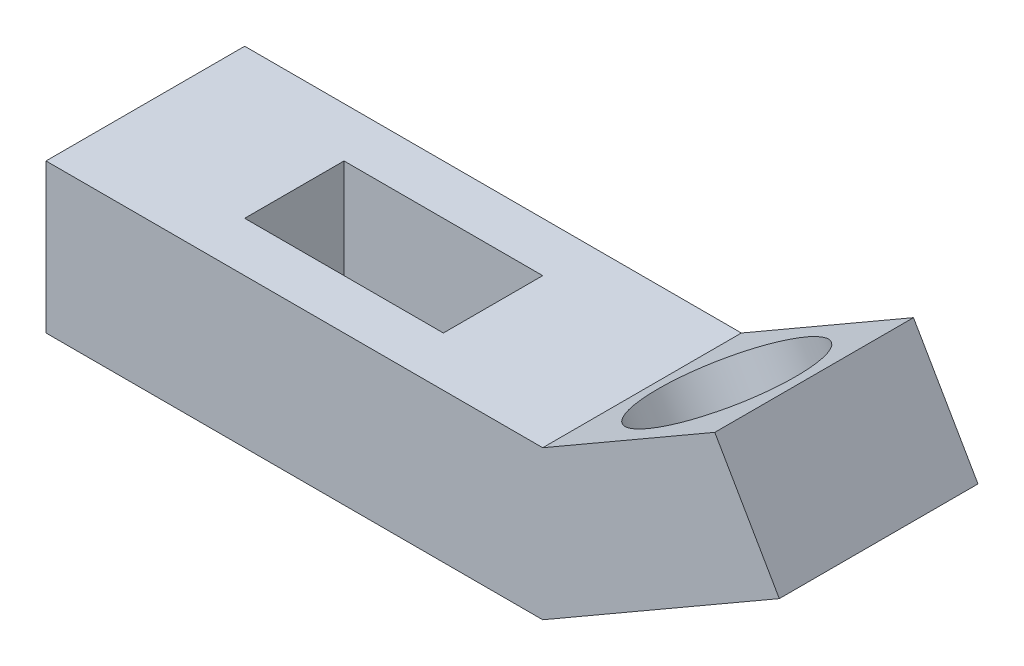
ISO-10303-21;
HEADER;
FILE_DESCRIPTION(('STEP AP214'),'2;1');
FILE_NAME('part.step','',(''),(''),'','','');
FILE_SCHEMA(('AUTOMOTIVE_DESIGN { 1 0 10303 214 1 1 1 1 }'));
ENDSEC;
DATA;
#1=APPLICATION_CONTEXT('core data for automotive mechanical design processes');
#2=APPLICATION_PROTOCOL_DEFINITION('international standard','automotive_design',2000,#1);
#3=PRODUCT_CONTEXT('',#1,'mechanical');
#4=PRODUCT('Part','Part','',(#3));
#5=PRODUCT_RELATED_PRODUCT_CATEGORY('part','',(#4));
#6=PRODUCT_DEFINITION_FORMATION('','',#4);
#7=PRODUCT_DEFINITION_CONTEXT('part definition',#1,'design');
#8=PRODUCT_DEFINITION('design','',#6,#7);
#9=PRODUCT_DEFINITION_SHAPE('','',#8);
#10=(LENGTH_UNIT() NAMED_UNIT(*) SI_UNIT(.MILLI.,.METRE.));
#11=(NAMED_UNIT(*) PLANE_ANGLE_UNIT() SI_UNIT($,.RADIAN.));
#12=(NAMED_UNIT(*) SI_UNIT($,.STERADIAN.) SOLID_ANGLE_UNIT());
#13=UNCERTAINTY_MEASURE_WITH_UNIT(LENGTH_MEASURE(1.E-05),#10,'distance_accuracy_value','');
#14=(GEOMETRIC_REPRESENTATION_CONTEXT(3) GLOBAL_UNCERTAINTY_ASSIGNED_CONTEXT((#13)) GLOBAL_UNIT_ASSIGNED_CONTEXT((#10,
#11,#12)) REPRESENTATION_CONTEXT('',''));
#15=CARTESIAN_POINT('',(0.,0.,0.));
#16=DIRECTION('',(0.,0.,1.));
#17=DIRECTION('',(1.,0.,0.));
#18=AXIS2_PLACEMENT_3D('',#15,#16,#17);
#19=CARTESIAN_POINT('',(0.,15.,0.));
#20=DIRECTION('',(0.,-1.,0.));
#21=DIRECTION('',(0.,0.,-1.));
#22=AXIS2_PLACEMENT_3D('',#19,#20,#21);
#23=PLANE('',#22);
#24=DIRECTION('',(0.,0.,1.));
#25=VECTOR('',#24,1.);
#26=CARTESIAN_POINT('',(-25.,15.,-10.));
#27=LINE('',#26,#25);
#28=CARTESIAN_POINT('',(-25.,15.,-10.));
#29=VERTEX_POINT('',#28);
#30=CARTESIAN_POINT('',(-25.,15.,10.));
#31=VERTEX_POINT('',#30);
#32=EDGE_CURVE('E182',#29,#31,#27,.T.);
#33=ORIENTED_EDGE('',*,*,#32,.T.);
#34=DIRECTION('',(1.,0.,0.));
#35=VECTOR('',#34,1.);
#36=CARTESIAN_POINT('',(25.,15.,10.));
#37=LINE('',#36,#35);
#38=CARTESIAN_POINT('',(25.,15.,10.));
#39=VERTEX_POINT('',#38);
#40=EDGE_CURVE('E185',#31,#39,#37,.T.);
#41=ORIENTED_EDGE('',*,*,#40,.T.);
#42=DIRECTION('',(0.,0.,-1.));
#43=VECTOR('',#42,1.);
#44=CARTESIAN_POINT('',(25.,15.,-10.));
#45=LINE('',#44,#43);
#46=CARTESIAN_POINT('',(25.,15.,-10.));
#47=VERTEX_POINT('',#46);
#48=EDGE_CURVE('E187',#39,#47,#45,.T.);
#49=ORIENTED_EDGE('',*,*,#48,.T.);
#50=DIRECTION('',(-1.,0.,0.));
#51=VECTOR('',#50,1.);
#52=CARTESIAN_POINT('',(25.,15.,-10.));
#53=LINE('',#52,#51);
#54=EDGE_CURVE('E189',#47,#29,#53,.T.);
#55=ORIENTED_EDGE('',*,*,#54,.T.);
#56=EDGE_LOOP('',(#33,#41,#49,#55));
#57=FACE_BOUND('',#56,.T.);
#58=DIRECTION('',(0.,0.,1.));
#59=VECTOR('',#58,1.);
#60=CARTESIAN_POINT('',(-10.,15.,-5.));
#61=LINE('',#60,#59);
#62=CARTESIAN_POINT('',(-10.,15.,-5.));
#63=VERTEX_POINT('',#62);
#64=CARTESIAN_POINT('',(-10.,15.,5.));
#65=VERTEX_POINT('',#64);
#66=EDGE_CURVE('E157',#63,#65,#61,.T.);
#67=ORIENTED_EDGE('',*,*,#66,.F.);
#68=DIRECTION('',(-1.,0.,0.));
#69=VECTOR('',#68,1.);
#70=CARTESIAN_POINT('',(10.,15.,-5.));
#71=LINE('',#70,#69);
#72=CARTESIAN_POINT('',(10.,15.,-5.));
#73=VERTEX_POINT('',#72);
#74=EDGE_CURVE('E164',#73,#63,#71,.T.);
#75=ORIENTED_EDGE('',*,*,#74,.F.);
#76=DIRECTION('',(0.,0.,-1.));
#77=VECTOR('',#76,1.);
#78=CARTESIAN_POINT('',(10.,15.,-5.));
#79=LINE('',#78,#77);
#80=CARTESIAN_POINT('',(10.,15.,5.));
#81=VERTEX_POINT('',#80);
#82=EDGE_CURVE('E162',#81,#73,#79,.T.);
#83=ORIENTED_EDGE('',*,*,#82,.F.);
#84=DIRECTION('',(1.,0.,0.));
#85=VECTOR('',#84,1.);
#86=CARTESIAN_POINT('',(10.,15.,5.));
#87=LINE('',#86,#85);
#88=EDGE_CURVE('E159',#65,#81,#87,.T.);
#89=ORIENTED_EDGE('',*,*,#88,.F.);
#90=EDGE_LOOP('',(#67,#75,#83,#89));
#91=FACE_BOUND('',#90,.T.);
#92=ADVANCED_FACE('F35',(#57,#91),#23,.F.);
#93=CARTESIAN_POINT('',(0.,0.,0.));
#94=DIRECTION('',(0.,-1.,0.));
#95=DIRECTION('',(0.,0.,-1.));
#96=AXIS2_PLACEMENT_3D('',#93,#94,#95);
#97=PLANE('',#96);
#98=DIRECTION('',(0.,0.,1.));
#99=VECTOR('',#98,1.);
#100=CARTESIAN_POINT('',(-25.,0.,-10.));
#101=LINE('',#100,#99);
#102=CARTESIAN_POINT('',(-25.,0.,-10.));
#103=VERTEX_POINT('',#102);
#104=CARTESIAN_POINT('',(-25.,0.,10.));
#105=VERTEX_POINT('',#104);
#106=EDGE_CURVE('E133',#103,#105,#101,.T.);
#107=ORIENTED_EDGE('',*,*,#106,.F.);
#108=DIRECTION('',(-1.,0.,0.));
#109=VECTOR('',#108,1.);
#110=CARTESIAN_POINT('',(25.,0.,-10.));
#111=LINE('',#110,#109);
#112=CARTESIAN_POINT('',(25.,0.,-10.));
#113=VERTEX_POINT('',#112);
#114=EDGE_CURVE('E120',#113,#103,#111,.T.);
#115=ORIENTED_EDGE('',*,*,#114,.F.);
#116=DIRECTION('',(0.,0.,-1.));
#117=VECTOR('',#116,1.);
#118=CARTESIAN_POINT('',(25.,0.,-10.));
#119=LINE('',#118,#117);
#120=CARTESIAN_POINT('',(25.,0.,10.));
#121=VERTEX_POINT('',#120);
#122=EDGE_CURVE('E114',#121,#113,#119,.T.);
#123=ORIENTED_EDGE('',*,*,#122,.F.);
#124=DIRECTION('',(1.,0.,0.));
#125=VECTOR('',#124,1.);
#126=CARTESIAN_POINT('',(25.,0.,10.));
#127=LINE('',#126,#125);
#128=EDGE_CURVE('E119',#105,#121,#127,.T.);
#129=ORIENTED_EDGE('',*,*,#128,.F.);
#130=EDGE_LOOP('',(#107,#115,#123,#129));
#131=FACE_BOUND('',#130,.T.);
#132=DIRECTION('',(-1.,0.,0.));
#133=VECTOR('',#132,1.);
#134=CARTESIAN_POINT('',(10.,0.,-5.));
#135=LINE('',#134,#133);
#136=CARTESIAN_POINT('',(10.,0.,-5.));
#137=VERTEX_POINT('',#136);
#138=CARTESIAN_POINT('',(-10.,0.,-5.));
#139=VERTEX_POINT('',#138);
#140=EDGE_CURVE('E160',#137,#139,#135,.T.);
#141=ORIENTED_EDGE('',*,*,#140,.T.);
#142=DIRECTION('',(0.,0.,1.));
#143=VECTOR('',#142,1.);
#144=CARTESIAN_POINT('',(-10.,0.,-5.));
#145=LINE('',#144,#143);
#146=CARTESIAN_POINT('',(-10.,0.,5.));
#147=VERTEX_POINT('',#146);
#148=EDGE_CURVE('E59',#139,#147,#145,.T.);
#149=ORIENTED_EDGE('',*,*,#148,.T.);
#150=DIRECTION('',(1.,0.,0.));
#151=VECTOR('',#150,1.);
#152=CARTESIAN_POINT('',(10.,0.,5.));
#153=LINE('',#152,#151);
#154=CARTESIAN_POINT('',(10.,0.,5.));
#155=VERTEX_POINT('',#154);
#156=EDGE_CURVE('E168',#147,#155,#153,.T.);
#157=ORIENTED_EDGE('',*,*,#156,.T.);
#158=DIRECTION('',(0.,0.,-1.));
#159=VECTOR('',#158,1.);
#160=CARTESIAN_POINT('',(10.,0.,-5.));
#161=LINE('',#160,#159);
#162=EDGE_CURVE('E171',#155,#137,#161,.T.);
#163=ORIENTED_EDGE('',*,*,#162,.T.);
#164=EDGE_LOOP('',(#141,#149,#157,#163));
#165=FACE_BOUND('',#164,.T.);
#166=ADVANCED_FACE('F117',(#131,#165),#97,.T.);
#167=CARTESIAN_POINT('',(-25.,15.,-10.));
#168=DIRECTION('',(1.,0.,0.));
#169=DIRECTION('',(0.,0.,-1.));
#170=AXIS2_PLACEMENT_3D('',#167,#168,#169);
#171=PLANE('',#170);
#172=ORIENTED_EDGE('',*,*,#106,.T.);
#173=DIRECTION('',(0.,-1.,0.));
#174=VECTOR('',#173,1.);
#175=CARTESIAN_POINT('',(-25.,15.,10.));
#176=LINE('',#175,#174);
#177=EDGE_CURVE('E11',#31,#105,#176,.T.);
#178=ORIENTED_EDGE('',*,*,#177,.F.);
#179=ORIENTED_EDGE('',*,*,#32,.F.);
#180=DIRECTION('',(0.,-1.,0.));
#181=VECTOR('',#180,1.);
#182=CARTESIAN_POINT('',(-25.,15.,-10.));
#183=LINE('',#182,#181);
#184=EDGE_CURVE('E44',#29,#103,#183,.T.);
#185=ORIENTED_EDGE('',*,*,#184,.T.);
#186=EDGE_LOOP('',(#172,#178,#179,#185));
#187=FACE_BOUND('',#186,.T.);
#188=ADVANCED_FACE('F37',(#187),#171,.F.);
#189=CARTESIAN_POINT('',(25.,15.,10.));
#190=DIRECTION('',(0.,0.,-1.));
#191=DIRECTION('',(-1.,0.,0.));
#192=AXIS2_PLACEMENT_3D('',#189,#190,#191);
#193=PLANE('',#192);
#194=ORIENTED_EDGE('',*,*,#128,.T.);
#195=DIRECTION('',(0.866025403784439,0.5,0.));
#196=VECTOR('',#195,1.);
#197=CARTESIAN_POINT('',(48.8156986040721,13.75,10.));
#198=LINE('',#197,#196);
#199=CARTESIAN_POINT('',(48.8156986040721,13.75,10.));
#200=VERTEX_POINT('',#199);
#201=EDGE_CURVE('E130',#121,#200,#198,.T.);
#202=ORIENTED_EDGE('',*,*,#201,.T.);
#203=DIRECTION('',(-0.5,0.866025403784438,0.));
#204=VECTOR('',#203,1.);
#205=CARTESIAN_POINT('',(42.3205080756888,25.,10.));
#206=LINE('',#205,#204);
#207=CARTESIAN_POINT('',(42.3205080756888,25.,10.));
#208=VERTEX_POINT('',#207);
#209=EDGE_CURVE('E139',#200,#208,#206,.T.);
#210=ORIENTED_EDGE('',*,*,#209,.T.);
#211=DIRECTION('',(-0.866025403784439,-0.5,0.));
#212=VECTOR('',#211,1.);
#213=CARTESIAN_POINT('',(25.,15.,10.));
#214=LINE('',#213,#212);
#215=EDGE_CURVE('E141',#208,#39,#214,.T.);
#216=ORIENTED_EDGE('',*,*,#215,.T.);
#217=ORIENTED_EDGE('',*,*,#40,.F.);
#218=ORIENTED_EDGE('',*,*,#177,.T.);
#219=EDGE_LOOP('',(#194,#202,#210,#216,#217,#218));
#220=FACE_BOUND('',#219,.T.);
#221=ADVANCED_FACE('F128',(#220),#193,.F.);
#222=CARTESIAN_POINT('',(25.,15.,-10.));
#223=DIRECTION('',(0.,0.,1.));
#224=DIRECTION('',(1.,0.,0.));
#225=AXIS2_PLACEMENT_3D('',#222,#223,#224);
#226=PLANE('',#225);
#227=ORIENTED_EDGE('',*,*,#114,.T.);
#228=ORIENTED_EDGE('',*,*,#184,.F.);
#229=ORIENTED_EDGE('',*,*,#54,.F.);
#230=DIRECTION('',(0.866025403784439,0.5,0.));
#231=VECTOR('',#230,1.);
#232=CARTESIAN_POINT('',(25.,15.,-10.));
#233=LINE('',#232,#231);
#234=CARTESIAN_POINT('',(42.3205080756888,25.,-10.));
#235=VERTEX_POINT('',#234);
#236=EDGE_CURVE('E146',#47,#235,#233,.T.);
#237=ORIENTED_EDGE('',*,*,#236,.T.);
#238=DIRECTION('',(0.5,-0.866025403784439,0.));
#239=VECTOR('',#238,1.);
#240=CARTESIAN_POINT('',(42.3205080756888,25.,-10.));
#241=LINE('',#240,#239);
#242=CARTESIAN_POINT('',(48.8156986040721,13.75,-10.));
#243=VERTEX_POINT('',#242);
#244=EDGE_CURVE('E153',#235,#243,#241,.T.);
#245=ORIENTED_EDGE('',*,*,#244,.T.);
#246=DIRECTION('',(-0.866025403784439,-0.5,0.));
#247=VECTOR('',#246,1.);
#248=CARTESIAN_POINT('',(48.8156986040721,13.75,-10.));
#249=LINE('',#248,#247);
#250=EDGE_CURVE('E155',#243,#113,#249,.T.);
#251=ORIENTED_EDGE('',*,*,#250,.T.);
#252=EDGE_LOOP('',(#227,#228,#229,#237,#245,#251));
#253=FACE_BOUND('',#252,.T.);
#254=ADVANCED_FACE('F199',(#253),#226,.F.);
#255=CARTESIAN_POINT('',(-10.,15.,-5.));
#256=DIRECTION('',(1.,0.,0.));
#257=DIRECTION('',(0.,0.,-1.));
#258=AXIS2_PLACEMENT_3D('',#255,#256,#257);
#259=PLANE('',#258);
#260=ORIENTED_EDGE('',*,*,#148,.F.);
#261=DIRECTION('',(0.,-1.,0.));
#262=VECTOR('',#261,1.);
#263=CARTESIAN_POINT('',(-10.,15.,-5.));
#264=LINE('',#263,#262);
#265=EDGE_CURVE('E166',#63,#139,#264,.T.);
#266=ORIENTED_EDGE('',*,*,#265,.F.);
#267=ORIENTED_EDGE('',*,*,#66,.T.);
#268=DIRECTION('',(0.,-1.,0.));
#269=VECTOR('',#268,1.);
#270=CARTESIAN_POINT('',(-10.,15.,5.));
#271=LINE('',#270,#269);
#272=EDGE_CURVE('E180',#65,#147,#271,.T.);
#273=ORIENTED_EDGE('',*,*,#272,.T.);
#274=EDGE_LOOP('',(#260,#266,#267,#273));
#275=FACE_BOUND('',#274,.T.);
#276=ADVANCED_FACE('F218',(#275),#259,.T.);
#277=CARTESIAN_POINT('',(10.,15.,5.));
#278=DIRECTION('',(0.,0.,-1.));
#279=DIRECTION('',(-1.,0.,0.));
#280=AXIS2_PLACEMENT_3D('',#277,#278,#279);
#281=PLANE('',#280);
#282=ORIENTED_EDGE('',*,*,#156,.F.);
#283=ORIENTED_EDGE('',*,*,#272,.F.);
#284=ORIENTED_EDGE('',*,*,#88,.T.);
#285=DIRECTION('',(0.,-1.,0.));
#286=VECTOR('',#285,1.);
#287=CARTESIAN_POINT('',(10.,15.,5.));
#288=LINE('',#287,#286);
#289=EDGE_CURVE('E178',#81,#155,#288,.T.);
#290=ORIENTED_EDGE('',*,*,#289,.T.);
#291=EDGE_LOOP('',(#282,#283,#284,#290));
#292=FACE_BOUND('',#291,.T.);
#293=ADVANCED_FACE('F220',(#292),#281,.T.);
#294=CARTESIAN_POINT('',(10.,15.,-5.));
#295=DIRECTION('',(-1.,0.,0.));
#296=DIRECTION('',(0.,0.,1.));
#297=AXIS2_PLACEMENT_3D('',#294,#295,#296);
#298=PLANE('',#297);
#299=ORIENTED_EDGE('',*,*,#162,.F.);
#300=ORIENTED_EDGE('',*,*,#289,.F.);
#301=ORIENTED_EDGE('',*,*,#82,.T.);
#302=DIRECTION('',(0.,-1.,0.));
#303=VECTOR('',#302,1.);
#304=CARTESIAN_POINT('',(10.,15.,-5.));
#305=LINE('',#304,#303);
#306=EDGE_CURVE('E51',#73,#137,#305,.T.);
#307=ORIENTED_EDGE('',*,*,#306,.T.);
#308=EDGE_LOOP('',(#299,#300,#301,#307));
#309=FACE_BOUND('',#308,.T.);
#310=ADVANCED_FACE('F225',(#309),#298,.T.);
#311=CARTESIAN_POINT('',(10.,15.,-5.));
#312=DIRECTION('',(0.,0.,1.));
#313=DIRECTION('',(1.,0.,0.));
#314=AXIS2_PLACEMENT_3D('',#311,#312,#313);
#315=PLANE('',#314);
#316=ORIENTED_EDGE('',*,*,#140,.F.);
#317=ORIENTED_EDGE('',*,*,#306,.F.);
#318=ORIENTED_EDGE('',*,*,#74,.T.);
#319=ORIENTED_EDGE('',*,*,#265,.T.);
#320=EDGE_LOOP('',(#316,#317,#318,#319));
#321=FACE_BOUND('',#320,.T.);
#322=ADVANCED_FACE('F223',(#321),#315,.T.);
#323=CARTESIAN_POINT('',(25.,15.,-44.5280682923328));
#324=DIRECTION('',(-0.5,0.866025403784439,0.));
#325=DIRECTION('',(-0.866025403784439,-0.5,0.));
#326=AXIS2_PLACEMENT_3D('',#323,#324,#325);
#327=PLANE('',#326);
#328=CARTESIAN_POINT('',(33.5298002192098,19.9246824526946,0.));
#329=DIRECTION('',(-0.500000000000002,0.866025403784438,0.));
#330=DIRECTION('',(-0.866025403784438,-0.500000000000002,0.));
#331=AXIS2_PLACEMENT_3D('',#328,#329,#330);
#332=CIRCLE('',#331,8.);
#333=CARTESIAN_POINT('',(26.6015969889343,15.9246824526946,0.));
#334=VERTEX_POINT('',#333);
#335=EDGE_CURVE('E144',#334,#334,#332,.T.);
#336=ORIENTED_EDGE('',*,*,#335,.F.);
#337=EDGE_LOOP('',(#336));
#338=FACE_BOUND('',#337,.T.);
#339=ORIENTED_EDGE('',*,*,#236,.F.);
#340=ORIENTED_EDGE('',*,*,#48,.F.);
#341=ORIENTED_EDGE('',*,*,#215,.F.);
#342=DIRECTION('',(0.,0.,1.));
#343=VECTOR('',#342,1.);
#344=CARTESIAN_POINT('',(42.3205080756888,25.,-44.5280682923328));
#345=LINE('',#344,#343);
#346=EDGE_CURVE('E151',#235,#208,#345,.T.);
#347=ORIENTED_EDGE('',*,*,#346,.F.);
#348=EDGE_LOOP('',(#339,#340,#341,#347));
#349=FACE_BOUND('',#348,.T.);
#350=ADVANCED_FACE('F208',(#338,#349),#327,.T.);
#351=CARTESIAN_POINT('',(42.3205080756888,25.,-44.5280682923328));
#352=DIRECTION('',(0.866025403784438,0.5,0.));
#353=DIRECTION('',(-0.5,0.866025403784439,0.));
#354=AXIS2_PLACEMENT_3D('',#351,#352,#353);
#355=PLANE('',#354);
#356=ORIENTED_EDGE('',*,*,#244,.F.);
#357=ORIENTED_EDGE('',*,*,#346,.T.);
#358=ORIENTED_EDGE('',*,*,#209,.F.);
#359=DIRECTION('',(0.,0.,1.));
#360=VECTOR('',#359,1.);
#361=CARTESIAN_POINT('',(48.8156986040721,13.75,-44.5280682923328));
#362=LINE('',#361,#360);
#363=EDGE_CURVE('E137',#243,#200,#362,.T.);
#364=ORIENTED_EDGE('',*,*,#363,.F.);
#365=EDGE_LOOP('',(#356,#357,#358,#364));
#366=FACE_BOUND('',#365,.T.);
#367=ADVANCED_FACE('F204',(#366),#355,.T.);
#368=CARTESIAN_POINT('',(48.8156986040721,13.75,-44.5280682923328));
#369=DIRECTION('',(0.5,-0.866025403784439,0.));
#370=DIRECTION('',(0.866025403784439,0.5,0.));
#371=AXIS2_PLACEMENT_3D('',#368,#369,#370);
#372=PLANE('',#371);
#373=CARTESIAN_POINT('',(40.0249907475931,8.67468245269453,0.));
#374=DIRECTION('',(0.5,-0.866025403784439,0.));
#375=DIRECTION('',(0.866025403784439,0.5,0.));
#376=AXIS2_PLACEMENT_3D('',#373,#374,#375);
#377=CIRCLE('',#376,8.);
#378=CARTESIAN_POINT('',(46.9531939778686,12.6746824526945,0.));
#379=VERTEX_POINT('',#378);
#380=EDGE_CURVE('E39',#379,#379,#377,.T.);
#381=ORIENTED_EDGE('',*,*,#380,.F.);
#382=EDGE_LOOP('',(#381));
#383=FACE_BOUND('',#382,.T.);
#384=ORIENTED_EDGE('',*,*,#250,.F.);
#385=ORIENTED_EDGE('',*,*,#363,.T.);
#386=ORIENTED_EDGE('',*,*,#201,.F.);
#387=ORIENTED_EDGE('',*,*,#122,.T.);
#388=EDGE_LOOP('',(#384,#385,#386,#387));
#389=FACE_BOUND('',#388,.T.);
#390=ADVANCED_FACE('F135',(#383,#389),#372,.T.);
#391=CARTESIAN_POINT('',(45.9789153986112,-1.63781754730547,0.));
#392=DIRECTION('',(-0.500000000000002,0.866025403784438,0.));
#393=DIRECTION('',(-0.866025403784438,-0.500000000000002,0.));
#394=AXIS2_PLACEMENT_3D('',#391,#392,#393);
#395=CYLINDRICAL_SURFACE('',#394,8.);
#396=ORIENTED_EDGE('',*,*,#380,.T.);
#397=EDGE_LOOP('',(#396));
#398=FACE_BOUND('',#397,.T.);
#399=ORIENTED_EDGE('',*,*,#335,.T.);
#400=EDGE_LOOP('',(#399));
#401=FACE_BOUND('',#400,.T.);
#402=ADVANCED_FACE('F312',(#398,#401),#395,.F.);
#403=CLOSED_SHELL('',(#92,#166,#188,#221,#254,#276,#293,#310,#322,#350,#367,#390,#402));
#404=MANIFOLD_SOLID_BREP('B2',#403);
#405=ADVANCED_BREP_SHAPE_REPRESENTATION('',(#18,#404),#14);
#406=SHAPE_DEFINITION_REPRESENTATION(#9,#405);
ENDSEC;
END-ISO-10303-21;
